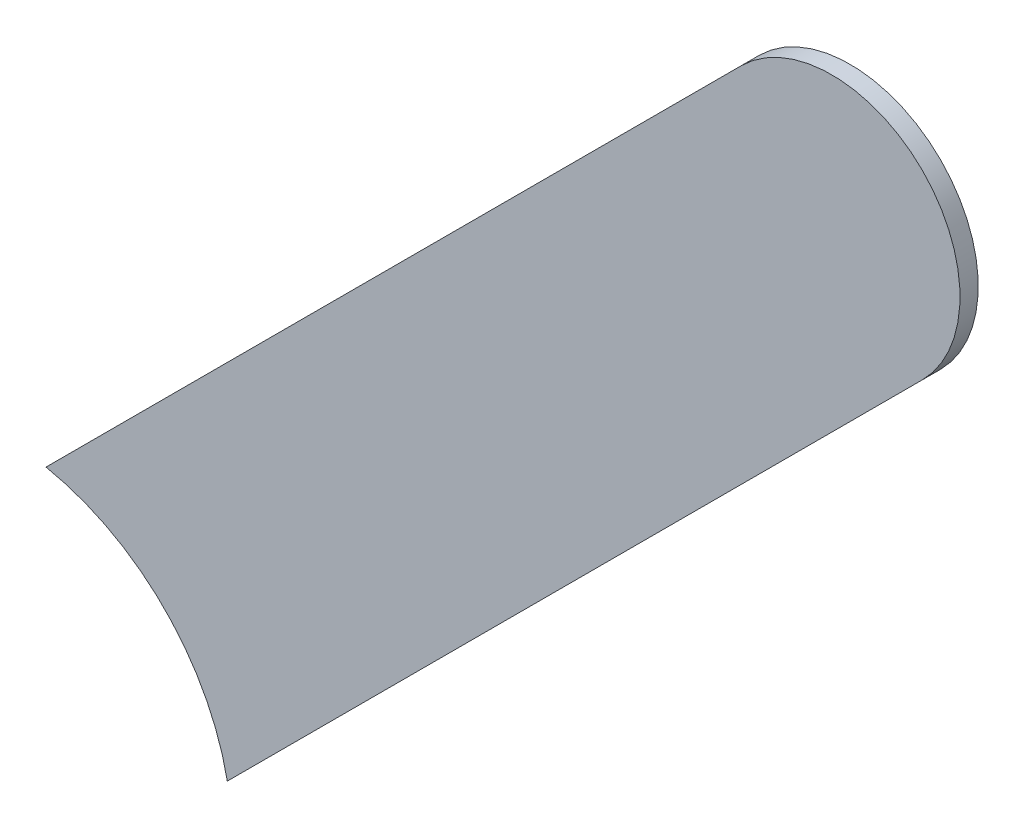
ISO-10303-21;
HEADER;
FILE_DESCRIPTION(('STEP AP214'),'2;1');
FILE_NAME('part.step','',(''),(''),'','','');
FILE_SCHEMA(('AUTOMOTIVE_DESIGN { 1 0 10303 214 1 1 1 1 }'));
ENDSEC;
DATA;
#1=APPLICATION_CONTEXT('core data for automotive mechanical design processes');
#2=APPLICATION_PROTOCOL_DEFINITION('international standard','automotive_design',2000,#1);
#3=PRODUCT_CONTEXT('',#1,'mechanical');
#4=PRODUCT('Part','Part','',(#3));
#5=PRODUCT_RELATED_PRODUCT_CATEGORY('part','',(#4));
#6=PRODUCT_DEFINITION_FORMATION('','',#4);
#7=PRODUCT_DEFINITION_CONTEXT('part definition',#1,'design');
#8=PRODUCT_DEFINITION('design','',#6,#7);
#9=PRODUCT_DEFINITION_SHAPE('','',#8);
#10=(LENGTH_UNIT() NAMED_UNIT(*) SI_UNIT(.MILLI.,.METRE.));
#11=(NAMED_UNIT(*) PLANE_ANGLE_UNIT() SI_UNIT($,.RADIAN.));
#12=(NAMED_UNIT(*) SI_UNIT($,.STERADIAN.) SOLID_ANGLE_UNIT());
#13=UNCERTAINTY_MEASURE_WITH_UNIT(LENGTH_MEASURE(1.E-05),#10,'distance_accuracy_value','');
#14=(GEOMETRIC_REPRESENTATION_CONTEXT(3) GLOBAL_UNCERTAINTY_ASSIGNED_CONTEXT((#13)) GLOBAL_UNIT_ASSIGNED_CONTEXT((#10,
#11,#12)) REPRESENTATION_CONTEXT('',''));
#15=CARTESIAN_POINT('',(0.,0.,0.));
#16=DIRECTION('',(0.,0.,1.));
#17=DIRECTION('',(1.,0.,0.));
#18=AXIS2_PLACEMENT_3D('',#15,#16,#17);
#19=CARTESIAN_POINT('',(39.8413508963948,88.4677992363948,0.));
#20=DIRECTION('',(-0.707106781186549,0.707106781186546,0.));
#21=DIRECTION('',(0.707106781186546,0.707106781186549,0.));
#22=AXIS2_PLACEMENT_3D('',#19,#20,#21);
#23=PLANE('',#22);
#24=DIRECTION('',(0.707106781186546,0.707106781186549,0.));
#25=VECTOR('',#24,1.);
#26=CARTESIAN_POINT('',(39.57677632,88.20322466,0.03556));
#27=LINE('',#26,#25);
#28=CARTESIAN_POINT('',(39.8413508963948,88.4677992363948,0.03556));
#29=VERTEX_POINT('',#28);
#30=CARTESIAN_POINT('',(41.19677562,89.82322396,0.03556));
#31=VERTEX_POINT('',#30);
#32=EDGE_CURVE('E11',#29,#31,#27,.T.);
#33=ORIENTED_EDGE('',*,*,#32,.F.);
#34=DIRECTION('',(0.,0.,1.));
#35=VECTOR('',#34,1.);
#36=CARTESIAN_POINT('',(39.8413508963948,88.4677992363948,0.));
#37=LINE('',#36,#35);
#38=CARTESIAN_POINT('',(39.8413508963948,88.4677992363948,0.));
#39=VERTEX_POINT('',#38);
#40=EDGE_CURVE('E24',#39,#29,#37,.T.);
#41=ORIENTED_EDGE('',*,*,#40,.F.);
#42=DIRECTION('',(0.707106781186546,0.707106781186549,0.));
#43=VECTOR('',#42,1.);
#44=CARTESIAN_POINT('',(39.57677632,88.20322466,0.));
#45=LINE('',#44,#43);
#46=CARTESIAN_POINT('',(41.19677562,89.82322396,0.));
#47=VERTEX_POINT('',#46);
#48=EDGE_CURVE('E75',#39,#47,#45,.T.);
#49=ORIENTED_EDGE('',*,*,#48,.T.);
#50=DIRECTION('',(0.,0.,1.));
#51=VECTOR('',#50,1.);
#52=CARTESIAN_POINT('',(41.19677562,89.82322396,0.));
#53=LINE('',#52,#51);
#54=EDGE_CURVE('E37',#47,#31,#53,.T.);
#55=ORIENTED_EDGE('',*,*,#54,.T.);
#56=EDGE_LOOP('',(#33,#41,#49,#55));
#57=FACE_BOUND('',#56,.T.);
#58=ADVANCED_FACE('F17',(#57),#23,.F.);
#59=CARTESIAN_POINT('',(41.01999924,90.00000034,0.));
#60=DIRECTION('',(0.,0.,-1.));
#61=DIRECTION('',(0.707106781186533,-0.707106781186562,0.));
#62=AXIS2_PLACEMENT_3D('',#59,#60,#61);
#63=CYLINDRICAL_SURFACE('',#62,0.249999554103225);
#64=CARTESIAN_POINT('',(41.01999924,90.00000034,0.03556));
#65=DIRECTION('',(0.,0.,1.));
#66=DIRECTION('',(0.707106781186533,-0.707106781186562,0.));
#67=AXIS2_PLACEMENT_3D('',#64,#65,#66);
#68=CIRCLE('',#67,0.249999554103225);
#69=CARTESIAN_POINT('',(40.84322286,90.17677672,0.03556));
#70=VERTEX_POINT('',#69);
#71=EDGE_CURVE('E83',#31,#70,#68,.T.);
#72=ORIENTED_EDGE('',*,*,#71,.F.);
#73=ORIENTED_EDGE('',*,*,#54,.F.);
#74=CARTESIAN_POINT('',(41.01999924,90.00000034,0.));
#75=DIRECTION('',(0.,0.,1.));
#76=DIRECTION('',(0.707106781186533,-0.707106781186562,0.));
#77=AXIS2_PLACEMENT_3D('',#74,#75,#76);
#78=CIRCLE('',#77,0.249999554103225);
#79=CARTESIAN_POINT('',(40.84322286,90.17677672,0.));
#80=VERTEX_POINT('',#79);
#81=EDGE_CURVE('E81',#47,#80,#78,.T.);
#82=ORIENTED_EDGE('',*,*,#81,.T.);
#83=DIRECTION('',(0.,0.,1.));
#84=VECTOR('',#83,1.);
#85=CARTESIAN_POINT('',(40.84322286,90.17677672,0.));
#86=LINE('',#85,#84);
#87=EDGE_CURVE('E67',#80,#70,#86,.T.);
#88=ORIENTED_EDGE('',*,*,#87,.T.);
#89=EDGE_LOOP('',(#72,#73,#82,#88));
#90=FACE_BOUND('',#89,.T.);
#91=ADVANCED_FACE('F89',(#90),#63,.T.);
#92=CARTESIAN_POINT('',(40.84322286,90.17677672,0.));
#93=DIRECTION('',(0.707106781186548,-0.707106781186548,0.));
#94=DIRECTION('',(-0.707106781186548,-0.707106781186548,0.));
#95=AXIS2_PLACEMENT_3D('',#92,#93,#94);
#96=PLANE('',#95);
#97=DIRECTION('',(-0.707106781186548,-0.707106781186548,0.));
#98=VECTOR('',#97,1.);
#99=CARTESIAN_POINT('',(40.84322286,90.17677672,0.03556));
#100=LINE('',#99,#98);
#101=CARTESIAN_POINT('',(39.4877981363948,88.8213519963948,0.03556));
#102=VERTEX_POINT('',#101);
#103=EDGE_CURVE('E71',#70,#102,#100,.T.);
#104=ORIENTED_EDGE('',*,*,#103,.F.);
#105=ORIENTED_EDGE('',*,*,#87,.F.);
#106=DIRECTION('',(-0.707106781186548,-0.707106781186548,0.));
#107=VECTOR('',#106,1.);
#108=CARTESIAN_POINT('',(40.84322286,90.17677672,0.));
#109=LINE('',#108,#107);
#110=CARTESIAN_POINT('',(39.4877981363948,88.8213519963948,0.));
#111=VERTEX_POINT('',#110);
#112=EDGE_CURVE('E63',#80,#111,#109,.T.);
#113=ORIENTED_EDGE('',*,*,#112,.T.);
#114=DIRECTION('',(0.,0.,1.));
#115=VECTOR('',#114,1.);
#116=CARTESIAN_POINT('',(39.4877981363948,88.8213519963948,0.));
#117=LINE('',#116,#115);
#118=EDGE_CURVE('E53',#111,#102,#117,.T.);
#119=ORIENTED_EDGE('',*,*,#118,.T.);
#120=EDGE_LOOP('',(#104,#105,#113,#119));
#121=FACE_BOUND('',#120,.T.);
#122=ADVANCED_FACE('F66',(#121),#96,.F.);
#123=CARTESIAN_POINT('',(39.39999994,88.38000104,0.));
#124=DIRECTION('',(0.,0.,-1.));
#125=DIRECTION('',(1.,0.,0.));
#126=AXIS2_PLACEMENT_3D('',#123,#124,#125);
#127=CYLINDRICAL_SURFACE('',#126,0.4499991);
#128=ORIENTED_EDGE('',*,*,#40,.T.);
#129=CARTESIAN_POINT('',(39.39999994,88.38000104,0.03556));
#130=DIRECTION('',(0.,0.,1.));
#131=DIRECTION('',(1.,0.,0.));
#132=AXIS2_PLACEMENT_3D('',#129,#130,#131);
#133=CIRCLE('',#132,0.4499991);
#134=EDGE_CURVE('E59',#29,#102,#133,.T.);
#135=ORIENTED_EDGE('',*,*,#134,.T.);
#136=ORIENTED_EDGE('',*,*,#118,.F.);
#137=CARTESIAN_POINT('',(39.39999994,88.38000104,0.));
#138=DIRECTION('',(0.,0.,1.));
#139=DIRECTION('',(1.,0.,0.));
#140=AXIS2_PLACEMENT_3D('',#137,#138,#139);
#141=CIRCLE('',#140,0.4499991);
#142=EDGE_CURVE('E57',#39,#111,#141,.T.);
#143=ORIENTED_EDGE('',*,*,#142,.F.);
#144=EDGE_LOOP('',(#128,#135,#136,#143));
#145=FACE_BOUND('',#144,.T.);
#146=ADVANCED_FACE('F55',(#145),#127,.F.);
#147=CARTESIAN_POINT('',(39.57677632,88.20322466,0.));
#148=DIRECTION('',(0.,0.,-1.));
#149=DIRECTION('',(-1.,0.,0.));
#150=AXIS2_PLACEMENT_3D('',#147,#148,#149);
#151=PLANE('',#150);
#152=ORIENTED_EDGE('',*,*,#48,.F.);
#153=ORIENTED_EDGE('',*,*,#142,.T.);
#154=ORIENTED_EDGE('',*,*,#112,.F.);
#155=ORIENTED_EDGE('',*,*,#81,.F.);
#156=EDGE_LOOP('',(#152,#153,#154,#155));
#157=FACE_BOUND('',#156,.T.);
#158=ADVANCED_FACE('F74',(#157),#151,.T.);
#159=CARTESIAN_POINT('',(39.57677632,88.20322466,0.03556));
#160=DIRECTION('',(0.,0.,-1.));
#161=DIRECTION('',(-1.,0.,0.));
#162=AXIS2_PLACEMENT_3D('',#159,#160,#161);
#163=PLANE('',#162);
#164=ORIENTED_EDGE('',*,*,#134,.F.);
#165=ORIENTED_EDGE('',*,*,#32,.T.);
#166=ORIENTED_EDGE('',*,*,#71,.T.);
#167=ORIENTED_EDGE('',*,*,#103,.T.);
#168=EDGE_LOOP('',(#164,#165,#166,#167));
#169=FACE_BOUND('',#168,.T.);
#170=ADVANCED_FACE('F91',(#169),#163,.F.);
#171=CLOSED_SHELL('',(#58,#91,#122,#146,#158,#170));
#172=MANIFOLD_SOLID_BREP('B1',#171);
#173=ADVANCED_BREP_SHAPE_REPRESENTATION('',(#18,#172),#14);
#174=SHAPE_DEFINITION_REPRESENTATION(#9,#173);
ENDSEC;
END-ISO-10303-21;
